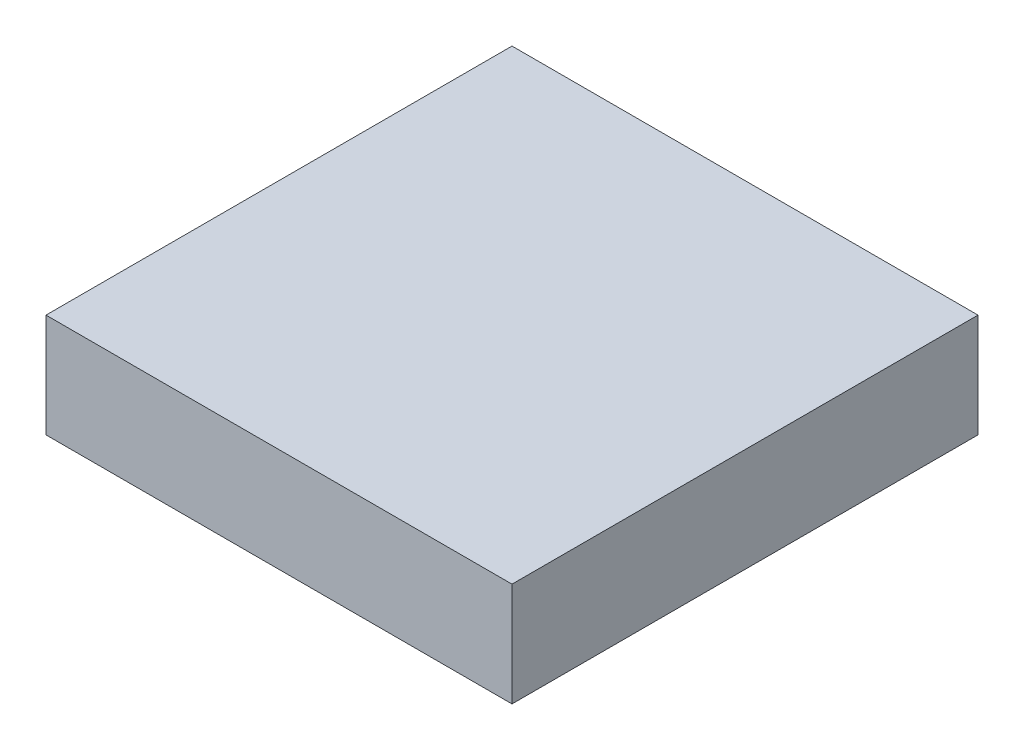
ISO-10303-21;
HEADER;
FILE_DESCRIPTION(('STEP AP214'),'2;1');
FILE_NAME('part.step','',(''),(''),'','','');
FILE_SCHEMA(('AUTOMOTIVE_DESIGN { 1 0 10303 214 1 1 1 1 }'));
ENDSEC;
DATA;
#1=APPLICATION_CONTEXT('core data for automotive mechanical design processes');
#2=APPLICATION_PROTOCOL_DEFINITION('international standard','automotive_design',2000,#1);
#3=PRODUCT_CONTEXT('',#1,'mechanical');
#4=PRODUCT('Part','Part','',(#3));
#5=PRODUCT_RELATED_PRODUCT_CATEGORY('part','',(#4));
#6=PRODUCT_DEFINITION_FORMATION('','',#4);
#7=PRODUCT_DEFINITION_CONTEXT('part definition',#1,'design');
#8=PRODUCT_DEFINITION('design','',#6,#7);
#9=PRODUCT_DEFINITION_SHAPE('','',#8);
#10=(LENGTH_UNIT() NAMED_UNIT(*) SI_UNIT(.MILLI.,.METRE.));
#11=(NAMED_UNIT(*) PLANE_ANGLE_UNIT() SI_UNIT($,.RADIAN.));
#12=(NAMED_UNIT(*) SI_UNIT($,.STERADIAN.) SOLID_ANGLE_UNIT());
#13=UNCERTAINTY_MEASURE_WITH_UNIT(LENGTH_MEASURE(1.E-05),#10,'distance_accuracy_value','');
#14=(GEOMETRIC_REPRESENTATION_CONTEXT(3) GLOBAL_UNCERTAINTY_ASSIGNED_CONTEXT((#13)) GLOBAL_UNIT_ASSIGNED_CONTEXT((#10,
#11,#12)) REPRESENTATION_CONTEXT('',''));
#15=CARTESIAN_POINT('',(0.,0.,0.));
#16=DIRECTION('',(0.,0.,1.));
#17=DIRECTION('',(1.,0.,0.));
#18=AXIS2_PLACEMENT_3D('',#15,#16,#17);
#19=CARTESIAN_POINT('',(-49.2103120119807,90.4875,-373.02999881807));
#20=DIRECTION('',(1.,0.,0.));
#21=DIRECTION('',(0.,0.,-1.));
#22=AXIS2_PLACEMENT_3D('',#19,#20,#21);
#23=PLANE('',#22);
#24=DIRECTION('',(0.,0.,1.));
#25=VECTOR('',#24,1.);
#26=CARTESIAN_POINT('',(-49.2103120119807,0.,-373.02999881807));
#27=LINE('',#26,#25);
#28=CARTESIAN_POINT('',(-49.2103120119807,0.,-373.02999881807));
#29=VERTEX_POINT('',#28);
#30=CARTESIAN_POINT('',(-49.2103120119807,0.,33.3700011819298));
#31=VERTEX_POINT('',#30);
#32=EDGE_CURVE('E111',#29,#31,#27,.T.);
#33=ORIENTED_EDGE('',*,*,#32,.T.);
#34=DIRECTION('',(0.,-1.,0.));
#35=VECTOR('',#34,1.);
#36=CARTESIAN_POINT('',(-49.2103120119807,90.4875,33.3700011819298));
#37=LINE('',#36,#35);
#38=CARTESIAN_POINT('',(-49.2103120119807,90.4875,33.3700011819298));
#39=VERTEX_POINT('',#38);
#40=EDGE_CURVE('E11',#39,#31,#37,.T.);
#41=ORIENTED_EDGE('',*,*,#40,.F.);
#42=DIRECTION('',(0.,0.,1.));
#43=VECTOR('',#42,1.);
#44=CARTESIAN_POINT('',(-49.2103120119807,90.4875,-373.02999881807));
#45=LINE('',#44,#43);
#46=CARTESIAN_POINT('',(-49.2103120119807,90.4875,-373.02999881807));
#47=VERTEX_POINT('',#46);
#48=EDGE_CURVE('E99',#47,#39,#45,.T.);
#49=ORIENTED_EDGE('',*,*,#48,.F.);
#50=DIRECTION('',(0.,-1.,0.));
#51=VECTOR('',#50,1.);
#52=CARTESIAN_POINT('',(-49.2103120119807,90.4875,-373.02999881807));
#53=LINE('',#52,#51);
#54=EDGE_CURVE('E107',#47,#29,#53,.T.);
#55=ORIENTED_EDGE('',*,*,#54,.T.);
#56=EDGE_LOOP('',(#33,#41,#49,#55));
#57=FACE_BOUND('',#56,.T.);
#58=ADVANCED_FACE('F48',(#57),#23,.F.);
#59=CARTESIAN_POINT('',(-49.2103120119807,90.4875,33.3700011819298));
#60=DIRECTION('',(0.,0.,-1.));
#61=DIRECTION('',(-1.,0.,0.));
#62=AXIS2_PLACEMENT_3D('',#59,#60,#61);
#63=PLANE('',#62);
#64=DIRECTION('',(1.,0.,0.));
#65=VECTOR('',#64,1.);
#66=CARTESIAN_POINT('',(-49.2103120119807,0.,33.3700011819298));
#67=LINE('',#66,#65);
#68=CARTESIAN_POINT('',(357.189687988019,0.,33.3700011819298));
#69=VERTEX_POINT('',#68);
#70=EDGE_CURVE('E103',#31,#69,#67,.T.);
#71=ORIENTED_EDGE('',*,*,#70,.T.);
#72=DIRECTION('',(0.,-1.,0.));
#73=VECTOR('',#72,1.);
#74=CARTESIAN_POINT('',(357.189687988019,90.4875,33.3700011819298));
#75=LINE('',#74,#73);
#76=CARTESIAN_POINT('',(357.189687988019,90.4875,33.3700011819298));
#77=VERTEX_POINT('',#76);
#78=EDGE_CURVE('E56',#77,#69,#75,.T.);
#79=ORIENTED_EDGE('',*,*,#78,.F.);
#80=DIRECTION('',(1.,0.,0.));
#81=VECTOR('',#80,1.);
#82=CARTESIAN_POINT('',(-49.2103120119807,90.4875,33.3700011819298));
#83=LINE('',#82,#81);
#84=EDGE_CURVE('E94',#39,#77,#83,.T.);
#85=ORIENTED_EDGE('',*,*,#84,.F.);
#86=ORIENTED_EDGE('',*,*,#40,.T.);
#87=EDGE_LOOP('',(#71,#79,#85,#86));
#88=FACE_BOUND('',#87,.T.);
#89=ADVANCED_FACE('F102',(#88),#63,.F.);
#90=CARTESIAN_POINT('',(357.189687988019,90.4875,-373.02999881807));
#91=DIRECTION('',(-1.,0.,0.));
#92=DIRECTION('',(0.,0.,1.));
#93=AXIS2_PLACEMENT_3D('',#90,#91,#92);
#94=PLANE('',#93);
#95=DIRECTION('',(0.,0.,-1.));
#96=VECTOR('',#95,1.);
#97=CARTESIAN_POINT('',(357.189687988019,0.,-373.02999881807));
#98=LINE('',#97,#96);
#99=CARTESIAN_POINT('',(357.189687988019,0.,-373.02999881807));
#100=VERTEX_POINT('',#99);
#101=EDGE_CURVE('E81',#69,#100,#98,.T.);
#102=ORIENTED_EDGE('',*,*,#101,.T.);
#103=DIRECTION('',(0.,-1.,0.));
#104=VECTOR('',#103,1.);
#105=CARTESIAN_POINT('',(357.189687988019,90.4875,-373.02999881807));
#106=LINE('',#105,#104);
#107=CARTESIAN_POINT('',(357.189687988019,90.4875,-373.02999881807));
#108=VERTEX_POINT('',#107);
#109=EDGE_CURVE('E104',#108,#100,#106,.T.);
#110=ORIENTED_EDGE('',*,*,#109,.F.);
#111=DIRECTION('',(0.,0.,-1.));
#112=VECTOR('',#111,1.);
#113=CARTESIAN_POINT('',(357.189687988019,90.4875,-373.02999881807));
#114=LINE('',#113,#112);
#115=EDGE_CURVE('E97',#77,#108,#114,.T.);
#116=ORIENTED_EDGE('',*,*,#115,.F.);
#117=ORIENTED_EDGE('',*,*,#78,.T.);
#118=EDGE_LOOP('',(#102,#110,#116,#117));
#119=FACE_BOUND('',#118,.T.);
#120=ADVANCED_FACE('F105',(#119),#94,.F.);
#121=CARTESIAN_POINT('',(-49.2103120119807,90.4875,-373.02999881807));
#122=DIRECTION('',(0.,0.,1.));
#123=DIRECTION('',(1.,0.,0.));
#124=AXIS2_PLACEMENT_3D('',#121,#122,#123);
#125=PLANE('',#124);
#126=DIRECTION('',(-1.,0.,0.));
#127=VECTOR('',#126,1.);
#128=CARTESIAN_POINT('',(-49.2103120119807,0.,-373.02999881807));
#129=LINE('',#128,#127);
#130=EDGE_CURVE('E87',#100,#29,#129,.T.);
#131=ORIENTED_EDGE('',*,*,#130,.T.);
#132=ORIENTED_EDGE('',*,*,#54,.F.);
#133=DIRECTION('',(-1.,0.,0.));
#134=VECTOR('',#133,1.);
#135=CARTESIAN_POINT('',(-49.2103120119807,90.4875,-373.02999881807));
#136=LINE('',#135,#134);
#137=EDGE_CURVE('E64',#108,#47,#136,.T.);
#138=ORIENTED_EDGE('',*,*,#137,.F.);
#139=ORIENTED_EDGE('',*,*,#109,.T.);
#140=EDGE_LOOP('',(#131,#132,#138,#139));
#141=FACE_BOUND('',#140,.T.);
#142=ADVANCED_FACE('F118',(#141),#125,.F.);
#143=CARTESIAN_POINT('',(0.,90.4875,0.));
#144=DIRECTION('',(0.,1.,0.));
#145=DIRECTION('',(0.,0.,1.));
#146=AXIS2_PLACEMENT_3D('',#143,#144,#145);
#147=PLANE('',#146);
#148=ORIENTED_EDGE('',*,*,#48,.T.);
#149=ORIENTED_EDGE('',*,*,#84,.T.);
#150=ORIENTED_EDGE('',*,*,#115,.T.);
#151=ORIENTED_EDGE('',*,*,#137,.T.);
#152=EDGE_LOOP('',(#148,#149,#150,#151));
#153=FACE_BOUND('',#152,.T.);
#154=ADVANCED_FACE('F95',(#153),#147,.T.);
#155=CARTESIAN_POINT('',(0.,0.,0.));
#156=DIRECTION('',(0.,1.,0.));
#157=DIRECTION('',(0.,0.,1.));
#158=AXIS2_PLACEMENT_3D('',#155,#156,#157);
#159=PLANE('',#158);
#160=ORIENTED_EDGE('',*,*,#32,.F.);
#161=ORIENTED_EDGE('',*,*,#130,.F.);
#162=ORIENTED_EDGE('',*,*,#101,.F.);
#163=ORIENTED_EDGE('',*,*,#70,.F.);
#164=EDGE_LOOP('',(#160,#161,#162,#163));
#165=FACE_BOUND('',#164,.T.);
#166=ADVANCED_FACE('F121',(#165),#159,.F.);
#167=CLOSED_SHELL('',(#58,#89,#120,#142,#154,#166));
#168=MANIFOLD_SOLID_BREP('B2',#167);
#169=ADVANCED_BREP_SHAPE_REPRESENTATION('',(#18,#168),#14);
#170=SHAPE_DEFINITION_REPRESENTATION(#9,#169);
ENDSEC;
END-ISO-10303-21;
